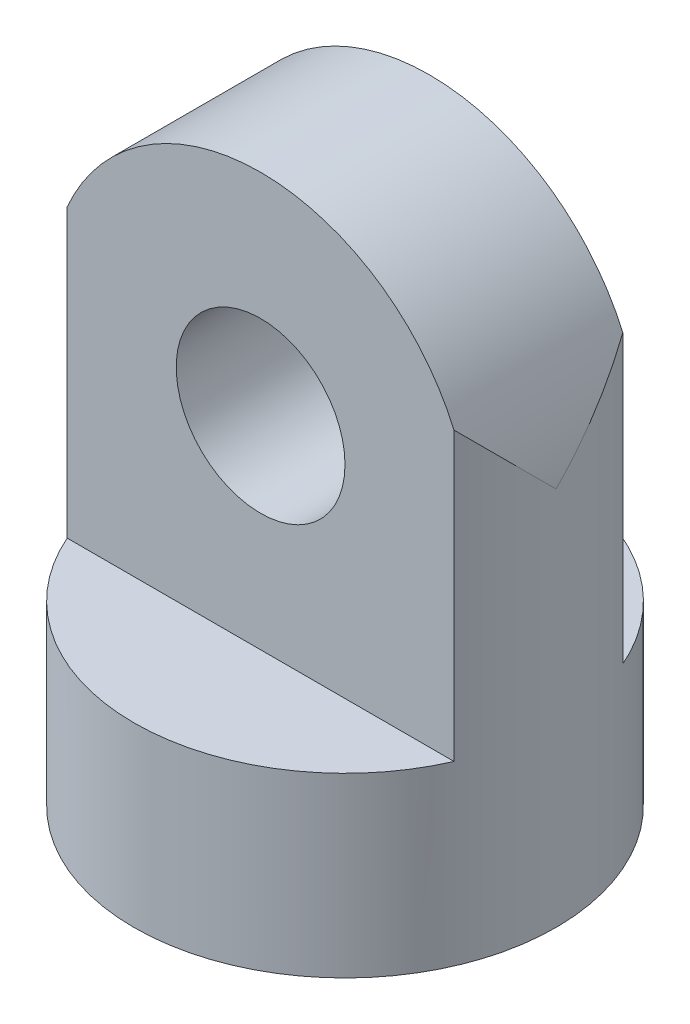
ISO-10303-21;
HEADER;
FILE_DESCRIPTION(('STEP AP214'),'2;1');
FILE_NAME('part.step','',(''),(''),'','','');
FILE_SCHEMA(('AUTOMOTIVE_DESIGN { 1 0 10303 214 1 1 1 1 }'));
ENDSEC;
DATA;
#1=APPLICATION_CONTEXT('core data for automotive mechanical design processes');
#2=APPLICATION_PROTOCOL_DEFINITION('international standard','automotive_design',2000,#1);
#3=PRODUCT_CONTEXT('',#1,'mechanical');
#4=PRODUCT('Part','Part','',(#3));
#5=PRODUCT_RELATED_PRODUCT_CATEGORY('part','',(#4));
#6=PRODUCT_DEFINITION_FORMATION('','',#4);
#7=PRODUCT_DEFINITION_CONTEXT('part definition',#1,'design');
#8=PRODUCT_DEFINITION('design','',#6,#7);
#9=PRODUCT_DEFINITION_SHAPE('','',#8);
#10=(LENGTH_UNIT() NAMED_UNIT(*) SI_UNIT(.MILLI.,.METRE.));
#11=(NAMED_UNIT(*) PLANE_ANGLE_UNIT() SI_UNIT($,.RADIAN.));
#12=(NAMED_UNIT(*) SI_UNIT($,.STERADIAN.) SOLID_ANGLE_UNIT());
#13=UNCERTAINTY_MEASURE_WITH_UNIT(LENGTH_MEASURE(1.E-05),#10,'distance_accuracy_value','');
#14=(GEOMETRIC_REPRESENTATION_CONTEXT(3) GLOBAL_UNCERTAINTY_ASSIGNED_CONTEXT((#13)) GLOBAL_UNIT_ASSIGNED_CONTEXT((#10,
#11,#12)) REPRESENTATION_CONTEXT('',''));
#15=CARTESIAN_POINT('',(0.,0.,0.));
#16=DIRECTION('',(0.,0.,1.));
#17=DIRECTION('',(1.,0.,0.));
#18=AXIS2_PLACEMENT_3D('',#15,#16,#17);
#19=CARTESIAN_POINT('',(0.,0.,0.));
#20=DIRECTION('',(0.,1.,0.));
#21=DIRECTION('',(0.,0.,1.));
#22=AXIS2_PLACEMENT_3D('',#19,#20,#21);
#23=PLANE('',#22);
#24=CARTESIAN_POINT('',(0.,0.,0.));
#25=DIRECTION('',(0.,-1.,0.));
#26=DIRECTION('',(0.,0.,-1.));
#27=AXIS2_PLACEMENT_3D('',#24,#25,#26);
#28=CIRCLE('',#27,1.);
#29=CARTESIAN_POINT('',(0.,0.,-1.));
#30=VERTEX_POINT('',#29);
#31=EDGE_CURVE('E152',#30,#30,#28,.T.);
#32=ORIENTED_EDGE('',*,*,#31,.F.);
#33=EDGE_LOOP('',(#32));
#34=FACE_BOUND('',#33,.T.);
#35=CARTESIAN_POINT('',(0.,0.,0.));
#36=DIRECTION('',(0.,1.,0.));
#37=DIRECTION('',(0.,0.,1.));
#38=AXIS2_PLACEMENT_3D('',#35,#36,#37);
#39=CIRCLE('',#38,2.5);
#40=CARTESIAN_POINT('',(0.,0.,2.5));
#41=VERTEX_POINT('',#40);
#42=EDGE_CURVE('E42',#41,#41,#39,.T.);
#43=ORIENTED_EDGE('',*,*,#42,.F.);
#44=EDGE_LOOP('',(#43));
#45=FACE_BOUND('',#44,.T.);
#46=ADVANCED_FACE('F38',(#34,#45),#23,.F.);
#47=CARTESIAN_POINT('',(0.,4.5,1.));
#48=DIRECTION('',(0.,0.,1.));
#49=DIRECTION('',(1.,0.,0.));
#50=AXIS2_PLACEMENT_3D('',#47,#48,#49);
#51=PLANE('',#50);
#52=CARTESIAN_POINT('',(0.,4.5,1.));
#53=DIRECTION('',(0.,0.,1.));
#54=DIRECTION('',(1.,0.,0.));
#55=AXIS2_PLACEMENT_3D('',#52,#53,#54);
#56=CIRCLE('',#55,1.);
#57=CARTESIAN_POINT('',(1.,4.5,1.));
#58=VERTEX_POINT('',#57);
#59=EDGE_CURVE('E106',#58,#58,#56,.T.);
#60=ORIENTED_EDGE('',*,*,#59,.F.);
#61=EDGE_LOOP('',(#60));
#62=FACE_BOUND('',#61,.T.);
#63=CARTESIAN_POINT('',(0.,4.5,1.));
#64=DIRECTION('',(0.,0.,1.));
#65=DIRECTION('',(1.,0.,0.));
#66=AXIS2_PLACEMENT_3D('',#63,#64,#65);
#67=CIRCLE('',#66,2.5);
#68=CARTESIAN_POINT('',(2.29128784747792,5.5,1.));
#69=VERTEX_POINT('',#68);
#70=CARTESIAN_POINT('',(-2.29128784747792,5.5,1.));
#71=VERTEX_POINT('',#70);
#72=EDGE_CURVE('E93',#69,#71,#67,.T.);
#73=ORIENTED_EDGE('',*,*,#72,.T.);
#74=DIRECTION('',(0.,-1.,0.));
#75=VECTOR('',#74,1.);
#76=CARTESIAN_POINT('',(-2.29128784747792,7.,1.));
#77=LINE('',#76,#75);
#78=CARTESIAN_POINT('',(-2.29128784747792,2.1,1.));
#79=VERTEX_POINT('',#78);
#80=EDGE_CURVE('E54',#71,#79,#77,.T.);
#81=ORIENTED_EDGE('',*,*,#80,.T.);
#82=DIRECTION('',(1.,0.,0.));
#83=VECTOR('',#82,1.);
#84=CARTESIAN_POINT('',(0.,2.1,1.));
#85=LINE('',#84,#83);
#86=CARTESIAN_POINT('',(2.29128784747792,2.1,1.));
#87=VERTEX_POINT('',#86);
#88=EDGE_CURVE('E95',#79,#87,#85,.T.);
#89=ORIENTED_EDGE('',*,*,#88,.T.);
#90=DIRECTION('',(0.,-1.,0.));
#91=VECTOR('',#90,1.);
#92=CARTESIAN_POINT('',(2.29128784747792,7.,1.));
#93=LINE('',#92,#91);
#94=EDGE_CURVE('E84',#87,#69,#93,.F.);
#95=ORIENTED_EDGE('',*,*,#94,.T.);
#96=EDGE_LOOP('',(#73,#81,#89,#95));
#97=FACE_BOUND('',#96,.T.);
#98=ADVANCED_FACE('F92',(#62,#97),#51,.T.);
#99=CARTESIAN_POINT('',(0.,4.5,-1.));
#100=DIRECTION('',(0.,0.,1.));
#101=DIRECTION('',(1.,0.,0.));
#102=AXIS2_PLACEMENT_3D('',#99,#100,#101);
#103=PLANE('',#102);
#104=CARTESIAN_POINT('',(0.,4.5,-1.));
#105=DIRECTION('',(0.,0.,1.));
#106=DIRECTION('',(1.,0.,0.));
#107=AXIS2_PLACEMENT_3D('',#104,#105,#106);
#108=CIRCLE('',#107,1.);
#109=CARTESIAN_POINT('',(1.,4.5,-1.));
#110=VERTEX_POINT('',#109);
#111=EDGE_CURVE('E109',#110,#110,#108,.T.);
#112=ORIENTED_EDGE('',*,*,#111,.T.);
#113=EDGE_LOOP('',(#112));
#114=FACE_BOUND('',#113,.T.);
#115=DIRECTION('',(0.,-1.,0.));
#116=VECTOR('',#115,1.);
#117=CARTESIAN_POINT('',(-2.29128784747792,7.,-1.));
#118=LINE('',#117,#116);
#119=CARTESIAN_POINT('',(-2.29128784747792,5.5,-1.));
#120=VERTEX_POINT('',#119);
#121=CARTESIAN_POINT('',(-2.29128784747792,2.1,-1.));
#122=VERTEX_POINT('',#121);
#123=EDGE_CURVE('E156',#120,#122,#118,.T.);
#124=ORIENTED_EDGE('',*,*,#123,.F.);
#125=CARTESIAN_POINT('',(0.,4.5,-1.));
#126=DIRECTION('',(0.,0.,1.));
#127=DIRECTION('',(1.,0.,0.));
#128=AXIS2_PLACEMENT_3D('',#125,#126,#127);
#129=CIRCLE('',#128,2.5);
#130=CARTESIAN_POINT('',(2.29128784747792,5.5,-1.));
#131=VERTEX_POINT('',#130);
#132=EDGE_CURVE('E101',#131,#120,#129,.T.);
#133=ORIENTED_EDGE('',*,*,#132,.F.);
#134=DIRECTION('',(0.,-1.,0.));
#135=VECTOR('',#134,1.);
#136=CARTESIAN_POINT('',(2.29128784747792,7.,-1.));
#137=LINE('',#136,#135);
#138=CARTESIAN_POINT('',(2.29128784747792,2.1,-1.));
#139=VERTEX_POINT('',#138);
#140=EDGE_CURVE('E170',#139,#131,#137,.F.);
#141=ORIENTED_EDGE('',*,*,#140,.F.);
#142=DIRECTION('',(1.,0.,0.));
#143=VECTOR('',#142,1.);
#144=CARTESIAN_POINT('',(0.,2.1,-1.));
#145=LINE('',#144,#143);
#146=EDGE_CURVE('E100',#122,#139,#145,.T.);
#147=ORIENTED_EDGE('',*,*,#146,.F.);
#148=EDGE_LOOP('',(#124,#133,#141,#147));
#149=FACE_BOUND('',#148,.T.);
#150=ADVANCED_FACE('F122',(#114,#149),#103,.F.);
#151=CARTESIAN_POINT('',(0.,4.5,1.));
#152=DIRECTION('',(0.,0.,-1.));
#153=DIRECTION('',(-1.,0.,0.));
#154=AXIS2_PLACEMENT_3D('',#151,#152,#153);
#155=CYLINDRICAL_SURFACE('',#154,2.5);
#156=CARTESIAN_POINT('',(0.,4.5,0.));
#157=DIRECTION('',(0.,-0.707106781186547,-0.707106781186547));
#158=DIRECTION('',(0.,0.707106781186547,-0.707106781186547));
#159=AXIS2_PLACEMENT_3D('',#156,#157,#158);
#160=ELLIPSE('',#159,3.53553390593274,2.5);
#161=CARTESIAN_POINT('',(2.5,4.5,0.));
#162=VERTEX_POINT('',#161);
#163=EDGE_CURVE('E61',#131,#162,#160,.T.);
#164=ORIENTED_EDGE('',*,*,#163,.F.);
#165=ORIENTED_EDGE('',*,*,#132,.T.);
#166=CARTESIAN_POINT('',(-2.5,4.5,0.));
#167=VERTEX_POINT('',#166);
#168=EDGE_CURVE('E169',#167,#120,#160,.T.);
#169=ORIENTED_EDGE('',*,*,#168,.F.);
#170=CARTESIAN_POINT('',(0.,4.5,0.));
#171=DIRECTION('',(0.,0.707106781186547,-0.707106781186547));
#172=DIRECTION('',(0.,-0.707106781186547,-0.707106781186547));
#173=AXIS2_PLACEMENT_3D('',#170,#171,#172);
#174=ELLIPSE('',#173,3.53553390593274,2.5);
#175=EDGE_CURVE('E89',#71,#167,#174,.F.);
#176=ORIENTED_EDGE('',*,*,#175,.F.);
#177=ORIENTED_EDGE('',*,*,#72,.F.);
#178=EDGE_CURVE('E82',#162,#69,#174,.F.);
#179=ORIENTED_EDGE('',*,*,#178,.F.);
#180=EDGE_LOOP('',(#164,#165,#169,#176,#177,#179));
#181=FACE_BOUND('',#180,.T.);
#182=ADVANCED_FACE('F98',(#181),#155,.T.);
#183=CARTESIAN_POINT('',(0.,2.1,0.));
#184=DIRECTION('',(0.,1.,0.));
#185=DIRECTION('',(0.,0.,1.));
#186=AXIS2_PLACEMENT_3D('',#183,#184,#185);
#187=PLANE('',#186);
#188=CARTESIAN_POINT('',(0.,2.1,0.));
#189=DIRECTION('',(0.,1.,0.));
#190=DIRECTION('',(0.,0.,1.));
#191=AXIS2_PLACEMENT_3D('',#188,#189,#190);
#192=CIRCLE('',#191,2.5);
#193=EDGE_CURVE('E12',#139,#122,#192,.T.);
#194=ORIENTED_EDGE('',*,*,#193,.T.);
#195=ORIENTED_EDGE('',*,*,#146,.T.);
#196=EDGE_LOOP('',(#194,#195));
#197=FACE_BOUND('',#196,.T.);
#198=ADVANCED_FACE('F130',(#197),#187,.T.);
#199=ORIENTED_EDGE('',*,*,#88,.F.);
#200=EDGE_CURVE('E47',#79,#87,#192,.T.);
#201=ORIENTED_EDGE('',*,*,#200,.T.);
#202=EDGE_LOOP('',(#199,#201));
#203=FACE_BOUND('',#202,.T.);
#204=ADVANCED_FACE('F127',(#203),#187,.T.);
#205=CARTESIAN_POINT('',(0.,2.1,0.));
#206=DIRECTION('',(0.,-1.,0.));
#207=DIRECTION('',(0.,0.,-1.));
#208=AXIS2_PLACEMENT_3D('',#205,#206,#207);
#209=CYLINDRICAL_SURFACE('',#208,2.5);
#210=ORIENTED_EDGE('',*,*,#42,.T.);
#211=EDGE_LOOP('',(#210));
#212=FACE_BOUND('',#211,.T.);
#213=ORIENTED_EDGE('',*,*,#200,.F.);
#214=ORIENTED_EDGE('',*,*,#80,.F.);
#215=ORIENTED_EDGE('',*,*,#175,.T.);
#216=ORIENTED_EDGE('',*,*,#168,.T.);
#217=ORIENTED_EDGE('',*,*,#123,.T.);
#218=ORIENTED_EDGE('',*,*,#193,.F.);
#219=ORIENTED_EDGE('',*,*,#140,.T.);
#220=ORIENTED_EDGE('',*,*,#163,.T.);
#221=ORIENTED_EDGE('',*,*,#178,.T.);
#222=ORIENTED_EDGE('',*,*,#94,.F.);
#223=EDGE_LOOP('',(#213,#214,#215,#216,#217,#218,#219,#220,#221,#222));
#224=FACE_BOUND('',#223,.T.);
#225=ADVANCED_FACE('F40',(#212,#224),#209,.T.);
#226=CARTESIAN_POINT('',(0.,4.5,1.));
#227=DIRECTION('',(0.,0.,-1.));
#228=DIRECTION('',(-1.,0.,0.));
#229=AXIS2_PLACEMENT_3D('',#226,#227,#228);
#230=CYLINDRICAL_SURFACE('',#229,1.);
#231=ORIENTED_EDGE('',*,*,#59,.T.);
#232=EDGE_LOOP('',(#231));
#233=FACE_BOUND('',#232,.T.);
#234=ORIENTED_EDGE('',*,*,#111,.F.);
#235=EDGE_LOOP('',(#234));
#236=FACE_BOUND('',#235,.T.);
#237=ADVANCED_FACE('F136',(#233,#236),#230,.F.);
#238=CARTESIAN_POINT('',(0.,2.,0.));
#239=DIRECTION('',(0.,-1.,0.));
#240=DIRECTION('',(0.,0.,-1.));
#241=AXIS2_PLACEMENT_3D('',#238,#239,#240);
#242=CYLINDRICAL_SURFACE('',#241,1.);
#243=CARTESIAN_POINT('',(0.,2.,0.));
#244=DIRECTION('',(0.,-1.,0.));
#245=DIRECTION('',(0.,0.,-1.));
#246=AXIS2_PLACEMENT_3D('',#243,#244,#245);
#247=CIRCLE('',#246,1.);
#248=CARTESIAN_POINT('',(0.,2.,-1.));
#249=VERTEX_POINT('',#248);
#250=EDGE_CURVE('E151',#249,#249,#247,.T.);
#251=ORIENTED_EDGE('',*,*,#250,.F.);
#252=EDGE_LOOP('',(#251));
#253=FACE_BOUND('',#252,.T.);
#254=ORIENTED_EDGE('',*,*,#31,.T.);
#255=EDGE_LOOP('',(#254));
#256=FACE_BOUND('',#255,.T.);
#257=ADVANCED_FACE('F139',(#253,#256),#242,.F.);
#258=CARTESIAN_POINT('',(0.,2.,0.));
#259=DIRECTION('',(0.,-1.,0.));
#260=DIRECTION('',(0.,0.,-1.));
#261=AXIS2_PLACEMENT_3D('',#258,#259,#260);
#262=PLANE('',#261);
#263=ORIENTED_EDGE('',*,*,#250,.T.);
#264=EDGE_LOOP('',(#263));
#265=FACE_BOUND('',#264,.T.);
#266=ADVANCED_FACE('F143',(#265),#262,.T.);
#267=CLOSED_SHELL('',(#46,#98,#150,#182,#198,#204,#225,#237,#257,#266));
#268=MANIFOLD_SOLID_BREP('B2',#267);
#269=ADVANCED_BREP_SHAPE_REPRESENTATION('',(#18,#268),#14);
#270=SHAPE_DEFINITION_REPRESENTATION(#9,#269);
ENDSEC;
END-ISO-10303-21;
